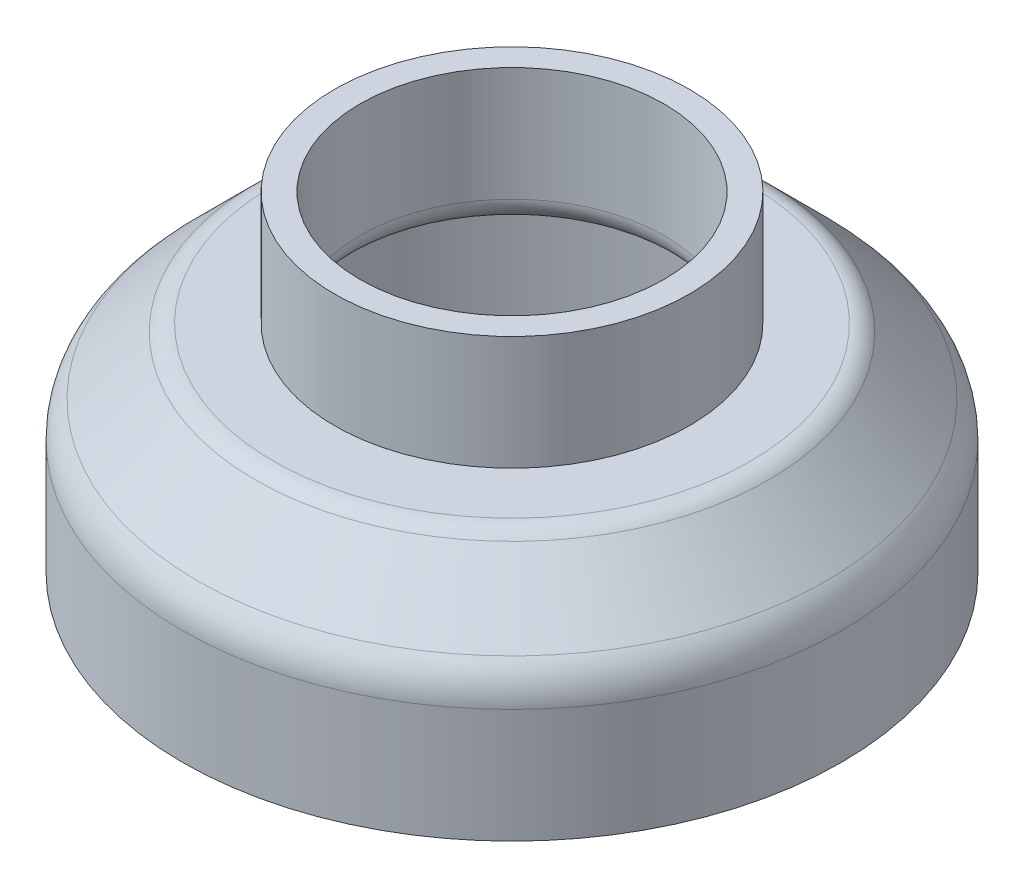
ISO-10303-21;
HEADER;
FILE_DESCRIPTION(('STEP AP214'),'2;1');
FILE_NAME('part.step','',(''),(''),'','','');
FILE_SCHEMA(('AUTOMOTIVE_DESIGN { 1 0 10303 214 1 1 1 1 }'));
ENDSEC;
DATA;
#1=APPLICATION_CONTEXT('core data for automotive mechanical design processes');
#2=APPLICATION_PROTOCOL_DEFINITION('international standard','automotive_design',2000,#1);
#3=PRODUCT_CONTEXT('',#1,'mechanical');
#4=PRODUCT('Part','Part','',(#3));
#5=PRODUCT_RELATED_PRODUCT_CATEGORY('part','',(#4));
#6=PRODUCT_DEFINITION_FORMATION('','',#4);
#7=PRODUCT_DEFINITION_CONTEXT('part definition',#1,'design');
#8=PRODUCT_DEFINITION('design','',#6,#7);
#9=PRODUCT_DEFINITION_SHAPE('','',#8);
#10=(LENGTH_UNIT() NAMED_UNIT(*) SI_UNIT(.MILLI.,.METRE.));
#11=(NAMED_UNIT(*) PLANE_ANGLE_UNIT() SI_UNIT($,.RADIAN.));
#12=(NAMED_UNIT(*) SI_UNIT($,.STERADIAN.) SOLID_ANGLE_UNIT());
#13=UNCERTAINTY_MEASURE_WITH_UNIT(LENGTH_MEASURE(1.E-05),#10,'distance_accuracy_value','');
#14=(GEOMETRIC_REPRESENTATION_CONTEXT(3) GLOBAL_UNCERTAINTY_ASSIGNED_CONTEXT((#13)) GLOBAL_UNIT_ASSIGNED_CONTEXT((#10,
#11,#12)) REPRESENTATION_CONTEXT('',''));
#15=CARTESIAN_POINT('',(0.,0.,0.));
#16=DIRECTION('',(0.,0.,1.));
#17=DIRECTION('',(1.,0.,0.));
#18=AXIS2_PLACEMENT_3D('',#15,#16,#17);
#19=CARTESIAN_POINT('',(6.,51.5838663386634,0.));
#20=DIRECTION('',(0.,1.,0.));
#21=DIRECTION('',(0.,0.,1.));
#22=AXIS2_PLACEMENT_3D('',#19,#20,#21);
#23=PLANE('',#22);
#24=CARTESIAN_POINT('',(0.,51.5838663386634,0.));
#25=DIRECTION('',(0.,-1.,0.));
#26=DIRECTION('',(0.,0.,-1.));
#27=AXIS2_PLACEMENT_3D('',#24,#25,#26);
#28=CIRCLE('',#27,6.);
#29=CARTESIAN_POINT('',(0.,51.5838663386634,-6.));
#30=VERTEX_POINT('',#29);
#31=EDGE_CURVE('E10',#30,#30,#28,.T.);
#32=ORIENTED_EDGE('',*,*,#31,.T.);
#33=EDGE_LOOP('',(#32));
#34=FACE_BOUND('',#33,.T.);
#35=CARTESIAN_POINT('',(0.,51.5838663386634,0.));
#36=DIRECTION('',(0.,-1.,0.));
#37=DIRECTION('',(0.,0.,-1.));
#38=AXIS2_PLACEMENT_3D('',#35,#36,#37);
#39=CIRCLE('',#38,7.);
#40=CARTESIAN_POINT('',(0.,51.5838663386634,-7.));
#41=VERTEX_POINT('',#40);
#42=EDGE_CURVE('E79',#41,#41,#39,.T.);
#43=ORIENTED_EDGE('',*,*,#42,.F.);
#44=EDGE_LOOP('',(#43));
#45=FACE_BOUND('',#44,.T.);
#46=ADVANCED_FACE('F33',(#34,#45),#23,.T.);
#47=CARTESIAN_POINT('',(0.,0.,0.));
#48=DIRECTION('',(0.,-1.,0.));
#49=DIRECTION('',(0.,0.,-1.));
#50=AXIS2_PLACEMENT_3D('',#47,#48,#49);
#51=CYLINDRICAL_SURFACE('',#50,6.);
#52=CARTESIAN_POINT('',(0.,47.0838663386634,0.));
#53=DIRECTION('',(0.,-1.,0.));
#54=DIRECTION('',(0.,0.,-1.));
#55=AXIS2_PLACEMENT_3D('',#52,#53,#54);
#56=CIRCLE('',#55,6.);
#57=CARTESIAN_POINT('',(0.,47.0838663386634,-6.));
#58=VERTEX_POINT('',#57);
#59=EDGE_CURVE('E39',#58,#58,#56,.T.);
#60=ORIENTED_EDGE('',*,*,#59,.T.);
#61=EDGE_LOOP('',(#60));
#62=FACE_BOUND('',#61,.T.);
#63=ORIENTED_EDGE('',*,*,#31,.F.);
#64=EDGE_LOOP('',(#63));
#65=FACE_BOUND('',#64,.T.);
#66=ADVANCED_FACE('F87',(#62,#65),#51,.F.);
#67=CARTESIAN_POINT('',(0.,47.0838663386634,0.));
#68=DIRECTION('',(0.,-1.,0.));
#69=DIRECTION('',(0.,0.,-1.));
#70=AXIS2_PLACEMENT_3D('',#67,#68,#69);
#71=TOROIDAL_SURFACE('',#70,7.,1.);
#72=CARTESIAN_POINT('',(0.,46.0838663386634,0.));
#73=DIRECTION('',(0.,-1.,0.));
#74=DIRECTION('',(0.,0.,-1.));
#75=AXIS2_PLACEMENT_3D('',#72,#73,#74);
#76=CIRCLE('',#75,7.);
#77=CARTESIAN_POINT('',(0.,46.0838663386634,-7.));
#78=VERTEX_POINT('',#77);
#79=EDGE_CURVE('E43',#78,#78,#76,.T.);
#80=ORIENTED_EDGE('',*,*,#79,.T.);
#81=EDGE_LOOP('',(#80));
#82=FACE_BOUND('',#81,.T.);
#83=ORIENTED_EDGE('',*,*,#59,.F.);
#84=EDGE_LOOP('',(#83));
#85=FACE_BOUND('',#84,.T.);
#86=ADVANCED_FACE('F91',(#82,#85),#71,.T.);
#87=CARTESIAN_POINT('',(7.,46.0838663386634,0.));
#88=DIRECTION('',(0.,-1.,0.));
#89=DIRECTION('',(0.,0.,-1.));
#90=AXIS2_PLACEMENT_3D('',#87,#88,#89);
#91=PLANE('',#90);
#92=CARTESIAN_POINT('',(0.,46.0838663386634,0.));
#93=DIRECTION('',(0.,-1.,0.));
#94=DIRECTION('',(0.,0.,-1.));
#95=AXIS2_PLACEMENT_3D('',#92,#93,#94);
#96=CIRCLE('',#95,9.41421356237313);
#97=CARTESIAN_POINT('',(0.,46.0838663386634,-9.41421356237313));
#98=VERTEX_POINT('',#97);
#99=EDGE_CURVE('E47',#98,#98,#96,.T.);
#100=ORIENTED_EDGE('',*,*,#99,.T.);
#101=EDGE_LOOP('',(#100));
#102=FACE_BOUND('',#101,.T.);
#103=ORIENTED_EDGE('',*,*,#79,.F.);
#104=EDGE_LOOP('',(#103));
#105=FACE_BOUND('',#104,.T.);
#106=ADVANCED_FACE('F95',(#102,#105),#91,.T.);
#107=CARTESIAN_POINT('',(0.,46.0838663386634,0.));
#108=DIRECTION('',(0.,-1.,0.));
#109=DIRECTION('',(0.,0.,-1.));
#110=AXIS2_PLACEMENT_3D('',#107,#108,#109);
#111=CONICAL_SURFACE('',#110,9.41421356237313,0.78539816339744);
#112=CARTESIAN_POINT('',(0.,43.7909731198499,0.));
#113=DIRECTION('',(0.,-1.,0.));
#114=DIRECTION('',(0.,0.,-1.));
#115=AXIS2_PLACEMENT_3D('',#112,#113,#114);
#116=CIRCLE('',#115,11.7071067811866);
#117=CARTESIAN_POINT('',(0.,43.7909731198499,-11.7071067811866));
#118=VERTEX_POINT('',#117);
#119=EDGE_CURVE('E52',#118,#118,#116,.T.);
#120=ORIENTED_EDGE('',*,*,#119,.T.);
#121=EDGE_LOOP('',(#120));
#122=FACE_BOUND('',#121,.T.);
#123=ORIENTED_EDGE('',*,*,#99,.F.);
#124=EDGE_LOOP('',(#123));
#125=FACE_BOUND('',#124,.T.);
#126=ADVANCED_FACE('F102',(#122,#125),#111,.F.);
#127=CARTESIAN_POINT('',(0.,43.0838663386634,0.));
#128=DIRECTION('',(0.,-1.,0.));
#129=DIRECTION('',(0.,0.,-1.));
#130=AXIS2_PLACEMENT_3D('',#127,#128,#129);
#131=TOROIDAL_SURFACE('',#130,11.,1.);
#132=CARTESIAN_POINT('',(0.,43.0838663386634,0.));
#133=DIRECTION('',(0.,-1.,0.));
#134=DIRECTION('',(0.,0.,-1.));
#135=AXIS2_PLACEMENT_3D('',#132,#133,#134);
#136=CIRCLE('',#135,12.);
#137=CARTESIAN_POINT('',(0.,43.0838663386634,-12.));
#138=VERTEX_POINT('',#137);
#139=EDGE_CURVE('E55',#138,#138,#136,.T.);
#140=ORIENTED_EDGE('',*,*,#139,.T.);
#141=EDGE_LOOP('',(#140));
#142=FACE_BOUND('',#141,.T.);
#143=ORIENTED_EDGE('',*,*,#119,.F.);
#144=EDGE_LOOP('',(#143));
#145=FACE_BOUND('',#144,.T.);
#146=ADVANCED_FACE('F106',(#142,#145),#131,.F.);
#147=CARTESIAN_POINT('',(0.,0.,0.));
#148=DIRECTION('',(0.,-1.,0.));
#149=DIRECTION('',(0.,0.,-1.));
#150=AXIS2_PLACEMENT_3D('',#147,#148,#149);
#151=CYLINDRICAL_SURFACE('',#150,12.);
#152=CARTESIAN_POINT('',(0.,38.5838663386634,0.));
#153=DIRECTION('',(0.,-1.,0.));
#154=DIRECTION('',(0.,0.,-1.));
#155=AXIS2_PLACEMENT_3D('',#152,#153,#154);
#156=CIRCLE('',#155,12.);
#157=CARTESIAN_POINT('',(0.,38.5838663386634,-12.));
#158=VERTEX_POINT('',#157);
#159=EDGE_CURVE('E58',#158,#158,#156,.T.);
#160=ORIENTED_EDGE('',*,*,#159,.T.);
#161=EDGE_LOOP('',(#160));
#162=FACE_BOUND('',#161,.T.);
#163=ORIENTED_EDGE('',*,*,#139,.F.);
#164=EDGE_LOOP('',(#163));
#165=FACE_BOUND('',#164,.T.);
#166=ADVANCED_FACE('F110',(#162,#165),#151,.F.);
#167=CARTESIAN_POINT('',(12.,38.5838663386634,0.));
#168=DIRECTION('',(0.,-1.,0.));
#169=DIRECTION('',(0.,0.,-1.));
#170=AXIS2_PLACEMENT_3D('',#167,#168,#169);
#171=PLANE('',#170);
#172=CARTESIAN_POINT('',(0.,38.5838663386634,0.));
#173=DIRECTION('',(0.,-1.,0.));
#174=DIRECTION('',(0.,0.,-1.));
#175=AXIS2_PLACEMENT_3D('',#172,#173,#174);
#176=CIRCLE('',#175,13.);
#177=CARTESIAN_POINT('',(0.,38.5838663386634,-13.));
#178=VERTEX_POINT('',#177);
#179=EDGE_CURVE('E61',#178,#178,#176,.T.);
#180=ORIENTED_EDGE('',*,*,#179,.T.);
#181=EDGE_LOOP('',(#180));
#182=FACE_BOUND('',#181,.T.);
#183=ORIENTED_EDGE('',*,*,#159,.F.);
#184=EDGE_LOOP('',(#183));
#185=FACE_BOUND('',#184,.T.);
#186=ADVANCED_FACE('F114',(#182,#185),#171,.T.);
#187=CARTESIAN_POINT('',(0.,0.,0.));
#188=DIRECTION('',(0.,-1.,0.));
#189=DIRECTION('',(0.,0.,-1.));
#190=AXIS2_PLACEMENT_3D('',#187,#188,#189);
#191=CYLINDRICAL_SURFACE('',#190,13.);
#192=CARTESIAN_POINT('',(0.,43.0838663386634,0.));
#193=DIRECTION('',(0.,-1.,0.));
#194=DIRECTION('',(0.,0.,-1.));
#195=AXIS2_PLACEMENT_3D('',#192,#193,#194);
#196=CIRCLE('',#195,13.);
#197=CARTESIAN_POINT('',(0.,43.0838663386634,-13.));
#198=VERTEX_POINT('',#197);
#199=EDGE_CURVE('E64',#198,#198,#196,.T.);
#200=ORIENTED_EDGE('',*,*,#199,.T.);
#201=EDGE_LOOP('',(#200));
#202=FACE_BOUND('',#201,.T.);
#203=ORIENTED_EDGE('',*,*,#179,.F.);
#204=EDGE_LOOP('',(#203));
#205=FACE_BOUND('',#204,.T.);
#206=ADVANCED_FACE('F118',(#202,#205),#191,.T.);
#207=CARTESIAN_POINT('',(0.,43.0838663386634,0.));
#208=DIRECTION('',(0.,-1.,0.));
#209=DIRECTION('',(0.,0.,-1.));
#210=AXIS2_PLACEMENT_3D('',#207,#208,#209);
#211=TOROIDAL_SURFACE('',#210,11.,2.);
#212=CARTESIAN_POINT('',(0.,44.4980799010365,0.));
#213=DIRECTION('',(0.,-1.,0.));
#214=DIRECTION('',(0.,0.,-1.));
#215=AXIS2_PLACEMENT_3D('',#212,#213,#214);
#216=CIRCLE('',#215,12.4142135623731);
#217=CARTESIAN_POINT('',(0.,44.4980799010365,-12.4142135623731));
#218=VERTEX_POINT('',#217);
#219=EDGE_CURVE('E67',#218,#218,#216,.T.);
#220=ORIENTED_EDGE('',*,*,#219,.T.);
#221=EDGE_LOOP('',(#220));
#222=FACE_BOUND('',#221,.T.);
#223=ORIENTED_EDGE('',*,*,#199,.F.);
#224=EDGE_LOOP('',(#223));
#225=FACE_BOUND('',#224,.T.);
#226=ADVANCED_FACE('F122',(#222,#225),#211,.T.);
#227=CARTESIAN_POINT('',(0.,44.4980799010365,0.));
#228=DIRECTION('',(0.,-1.,0.));
#229=DIRECTION('',(0.,0.,-1.));
#230=AXIS2_PLACEMENT_3D('',#227,#228,#229);
#231=CONICAL_SURFACE('',#230,12.4142135623731,0.785398163397443);
#232=CARTESIAN_POINT('',(0.,46.7909731198499,0.));
#233=DIRECTION('',(0.,-1.,0.));
#234=DIRECTION('',(0.,0.,-1.));
#235=AXIS2_PLACEMENT_3D('',#232,#233,#234);
#236=CIRCLE('',#235,10.1213203435597);
#237=CARTESIAN_POINT('',(0.,46.7909731198499,-10.1213203435597));
#238=VERTEX_POINT('',#237);
#239=EDGE_CURVE('E70',#238,#238,#236,.T.);
#240=ORIENTED_EDGE('',*,*,#239,.T.);
#241=EDGE_LOOP('',(#240));
#242=FACE_BOUND('',#241,.T.);
#243=ORIENTED_EDGE('',*,*,#219,.F.);
#244=EDGE_LOOP('',(#243));
#245=FACE_BOUND('',#244,.T.);
#246=ADVANCED_FACE('F126',(#242,#245),#231,.T.);
#247=CARTESIAN_POINT('',(0.,46.0838663386634,0.));
#248=DIRECTION('',(0.,-1.,0.));
#249=DIRECTION('',(0.,0.,-1.));
#250=AXIS2_PLACEMENT_3D('',#247,#248,#249);
#251=TOROIDAL_SURFACE('',#250,9.4142135623731,1.00000000000001);
#252=CARTESIAN_POINT('',(0.,47.0838663386634,0.));
#253=DIRECTION('',(0.,-1.,0.));
#254=DIRECTION('',(0.,0.,-1.));
#255=AXIS2_PLACEMENT_3D('',#252,#253,#254);
#256=CIRCLE('',#255,9.41421356237313);
#257=CARTESIAN_POINT('',(0.,47.0838663386634,-9.41421356237313));
#258=VERTEX_POINT('',#257);
#259=EDGE_CURVE('E73',#258,#258,#256,.T.);
#260=ORIENTED_EDGE('',*,*,#259,.T.);
#261=EDGE_LOOP('',(#260));
#262=FACE_BOUND('',#261,.T.);
#263=ORIENTED_EDGE('',*,*,#239,.F.);
#264=EDGE_LOOP('',(#263));
#265=FACE_BOUND('',#264,.T.);
#266=ADVANCED_FACE('F130',(#262,#265),#251,.T.);
#267=CARTESIAN_POINT('',(7.,47.0838663386634,0.));
#268=DIRECTION('',(0.,1.,0.));
#269=DIRECTION('',(0.,0.,1.));
#270=AXIS2_PLACEMENT_3D('',#267,#268,#269);
#271=PLANE('',#270);
#272=CARTESIAN_POINT('',(0.,47.0838663386634,0.));
#273=DIRECTION('',(0.,-1.,0.));
#274=DIRECTION('',(0.,0.,-1.));
#275=AXIS2_PLACEMENT_3D('',#272,#273,#274);
#276=CIRCLE('',#275,7.);
#277=CARTESIAN_POINT('',(0.,47.0838663386634,-7.));
#278=VERTEX_POINT('',#277);
#279=EDGE_CURVE('E76',#278,#278,#276,.T.);
#280=ORIENTED_EDGE('',*,*,#279,.T.);
#281=EDGE_LOOP('',(#280));
#282=FACE_BOUND('',#281,.T.);
#283=ORIENTED_EDGE('',*,*,#259,.F.);
#284=EDGE_LOOP('',(#283));
#285=FACE_BOUND('',#284,.T.);
#286=ADVANCED_FACE('F134',(#282,#285),#271,.T.);
#287=CARTESIAN_POINT('',(0.,0.,0.));
#288=DIRECTION('',(0.,-1.,0.));
#289=DIRECTION('',(0.,0.,-1.));
#290=AXIS2_PLACEMENT_3D('',#287,#288,#289);
#291=CYLINDRICAL_SURFACE('',#290,7.);
#292=ORIENTED_EDGE('',*,*,#42,.T.);
#293=EDGE_LOOP('',(#292));
#294=FACE_BOUND('',#293,.T.);
#295=ORIENTED_EDGE('',*,*,#279,.F.);
#296=EDGE_LOOP('',(#295));
#297=FACE_BOUND('',#296,.T.);
#298=ADVANCED_FACE('F83',(#294,#297),#291,.T.);
#299=CLOSED_SHELL('',(#46,#66,#86,#106,#126,#146,#166,#186,#206,#226,#246,#266,#286,#298));
#300=MANIFOLD_SOLID_BREP('B2',#299);
#301=ADVANCED_BREP_SHAPE_REPRESENTATION('',(#18,#300),#14);
#302=SHAPE_DEFINITION_REPRESENTATION(#9,#301);
ENDSEC;
END-ISO-10303-21;
